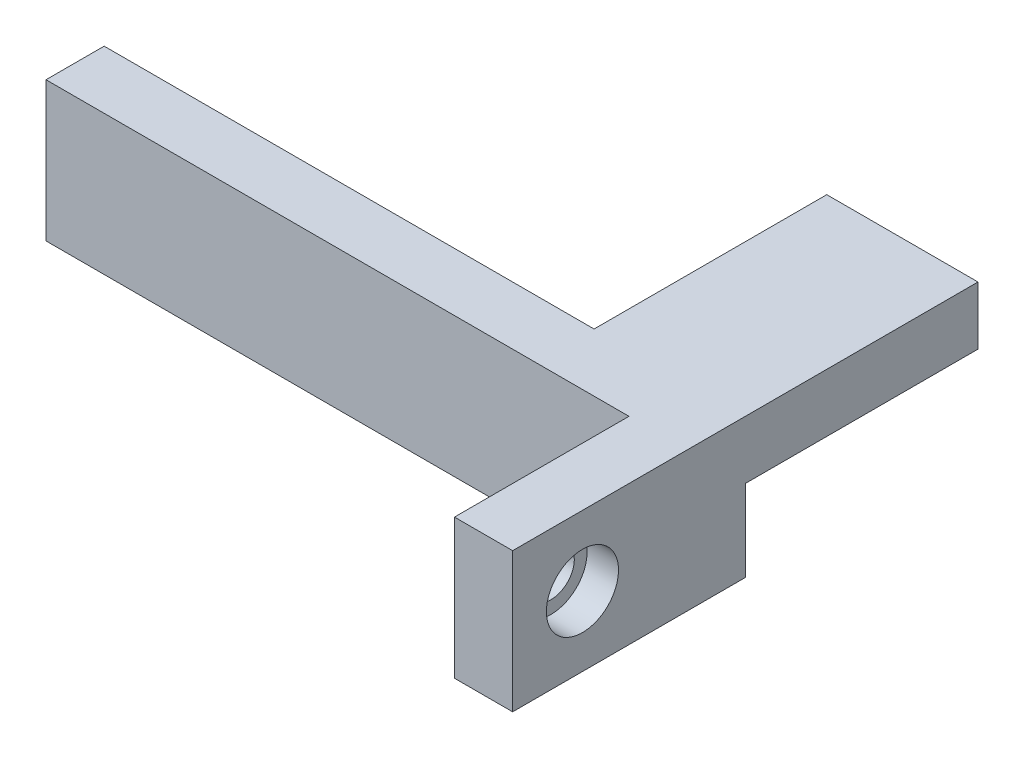
ISO-10303-21;
HEADER;
FILE_DESCRIPTION(('STEP AP214'),'2;1');
FILE_NAME('part.step','',(''),(''),'','','');
FILE_SCHEMA(('AUTOMOTIVE_DESIGN { 1 0 10303 214 1 1 1 1 }'));
ENDSEC;
DATA;
#1=APPLICATION_CONTEXT('core data for automotive mechanical design processes');
#2=APPLICATION_PROTOCOL_DEFINITION('international standard','automotive_design',2000,#1);
#3=PRODUCT_CONTEXT('',#1,'mechanical');
#4=PRODUCT('Part','Part','',(#3));
#5=PRODUCT_RELATED_PRODUCT_CATEGORY('part','',(#4));
#6=PRODUCT_DEFINITION_FORMATION('','',#4);
#7=PRODUCT_DEFINITION_CONTEXT('part definition',#1,'design');
#8=PRODUCT_DEFINITION('design','',#6,#7);
#9=PRODUCT_DEFINITION_SHAPE('','',#8);
#10=(LENGTH_UNIT() NAMED_UNIT(*) SI_UNIT(.MILLI.,.METRE.));
#11=(NAMED_UNIT(*) PLANE_ANGLE_UNIT() SI_UNIT($,.RADIAN.));
#12=(NAMED_UNIT(*) SI_UNIT($,.STERADIAN.) SOLID_ANGLE_UNIT());
#13=UNCERTAINTY_MEASURE_WITH_UNIT(LENGTH_MEASURE(1.E-05),#10,'distance_accuracy_value','');
#14=(GEOMETRIC_REPRESENTATION_CONTEXT(3) GLOBAL_UNCERTAINTY_ASSIGNED_CONTEXT((#13)) GLOBAL_UNIT_ASSIGNED_CONTEXT((#10,
#11,#12)) REPRESENTATION_CONTEXT('',''));
#15=CARTESIAN_POINT('',(0.,0.,0.));
#16=DIRECTION('',(0.,0.,1.));
#17=DIRECTION('',(1.,0.,0.));
#18=AXIS2_PLACEMENT_3D('',#15,#16,#17);
#19=CARTESIAN_POINT('',(-42.1106173211541,-0.999999999999982,9.));
#20=DIRECTION('',(1.,0.,0.));
#21=DIRECTION('',(0.,1.,0.));
#22=AXIS2_PLACEMENT_3D('',#19,#20,#21);
#23=CYLINDRICAL_SURFACE('',#22,2.);
#24=CARTESIAN_POINT('',(8.,-0.999999999999999,9.));
#25=DIRECTION('',(1.,0.,0.));
#26=DIRECTION('',(0.,0.,-1.));
#27=AXIS2_PLACEMENT_3D('',#24,#25,#26);
#28=CIRCLE('',#27,2.);
#29=CARTESIAN_POINT('',(7.99999999999999,1.,9.));
#30=VERTEX_POINT('',#29);
#31=EDGE_CURVE('E172',#30,#30,#28,.T.);
#32=CARTESIAN_POINT('',(10.3,-1.,9.));
#33=DIRECTION('',(1.,0.,0.));
#34=DIRECTION('',(0.,1.,0.));
#35=AXIS2_PLACEMENT_3D('',#32,#33,#34);
#36=CIRCLE('',#35,2.);
#37=CARTESIAN_POINT('',(10.3,1.,9.));
#38=VERTEX_POINT('',#37);
#39=EDGE_CURVE('E65',#38,#38,#36,.F.);
#40=CARTESIAN_POINT('',(7.99999999999999,1.,9.));
#41=CARTESIAN_POINT('',(8.02395833333333,1.,9.));
#42=CARTESIAN_POINT('',(8.04791666666666,1.,9.));
#43=CARTESIAN_POINT('',(8.09583333333332,1.,9.));
#44=CARTESIAN_POINT('',(8.11979166666666,1.,9.));
#45=CARTESIAN_POINT('',(8.16770833333333,1.,9.));
#46=CARTESIAN_POINT('',(8.19166666666666,1.,9.));
#47=CARTESIAN_POINT('',(8.23958333333333,1.,9.));
#48=CARTESIAN_POINT('',(8.26354166666666,1.,9.));
#49=CARTESIAN_POINT('',(8.31145833333333,1.,9.));
#50=CARTESIAN_POINT('',(8.33541666666666,1.,9.));
#51=CARTESIAN_POINT('',(8.38333333333333,1.,9.));
#52=CARTESIAN_POINT('',(8.40729166666666,1.,9.));
#53=CARTESIAN_POINT('',(8.45520833333333,1.,9.));
#54=CARTESIAN_POINT('',(8.47916666666666,1.,9.));
#55=CARTESIAN_POINT('',(8.52708333333333,1.,9.));
#56=CARTESIAN_POINT('',(8.55104166666666,1.,9.));
#57=CARTESIAN_POINT('',(8.59895833333333,1.,9.));
#58=CARTESIAN_POINT('',(8.62291666666667,1.,9.));
#59=CARTESIAN_POINT('',(8.67083333333333,1.,9.));
#60=CARTESIAN_POINT('',(8.69479166666667,1.,9.));
#61=CARTESIAN_POINT('',(8.74270833333333,1.,9.));
#62=CARTESIAN_POINT('',(8.76666666666666,1.,9.));
#63=CARTESIAN_POINT('',(8.81458333333333,1.,9.));
#64=CARTESIAN_POINT('',(8.83854166666666,1.,9.));
#65=CARTESIAN_POINT('',(8.88645833333333,1.,9.));
#66=CARTESIAN_POINT('',(8.91041666666666,1.,9.));
#67=CARTESIAN_POINT('',(8.95833333333333,1.,9.));
#68=CARTESIAN_POINT('',(8.98229166666667,1.,9.));
#69=CARTESIAN_POINT('',(9.03020833333333,1.,9.));
#70=CARTESIAN_POINT('',(9.05416666666667,1.,9.));
#71=CARTESIAN_POINT('',(9.10208333333333,1.,9.));
#72=CARTESIAN_POINT('',(9.12604166666667,1.,9.));
#73=CARTESIAN_POINT('',(9.17395833333333,1.,9.));
#74=CARTESIAN_POINT('',(9.19791666666666,1.,9.));
#75=CARTESIAN_POINT('',(9.24583333333333,1.,9.));
#76=CARTESIAN_POINT('',(9.26979166666666,1.,9.));
#77=CARTESIAN_POINT('',(9.31770833333333,1.,9.));
#78=CARTESIAN_POINT('',(9.34166666666667,1.,9.));
#79=CARTESIAN_POINT('',(9.38958333333333,1.,9.));
#80=CARTESIAN_POINT('',(9.41354166666667,1.,9.));
#81=CARTESIAN_POINT('',(9.46145833333333,1.,9.));
#82=CARTESIAN_POINT('',(9.48541666666667,1.,9.));
#83=CARTESIAN_POINT('',(9.53333333333333,1.,9.));
#84=CARTESIAN_POINT('',(9.55729166666667,1.,9.));
#85=CARTESIAN_POINT('',(9.60520833333333,1.,9.));
#86=CARTESIAN_POINT('',(9.62916666666667,1.,9.));
#87=CARTESIAN_POINT('',(9.67708333333333,1.,9.));
#88=CARTESIAN_POINT('',(9.70104166666667,1.,9.));
#89=CARTESIAN_POINT('',(9.74895833333333,1.,9.));
#90=CARTESIAN_POINT('',(9.77291666666667,1.,9.));
#91=CARTESIAN_POINT('',(9.82083333333334,1.,9.));
#92=CARTESIAN_POINT('',(9.84479166666667,1.,9.));
#93=CARTESIAN_POINT('',(9.89270833333333,1.,9.));
#94=CARTESIAN_POINT('',(9.91666666666667,1.,9.));
#95=CARTESIAN_POINT('',(9.96458333333333,1.,9.));
#96=CARTESIAN_POINT('',(9.98854166666667,1.,9.));
#97=CARTESIAN_POINT('',(10.0364583333333,1.,9.));
#98=CARTESIAN_POINT('',(10.0604166666667,1.,9.));
#99=CARTESIAN_POINT('',(10.1083333333333,1.,9.));
#100=CARTESIAN_POINT('',(10.1322916666667,1.,9.));
#101=CARTESIAN_POINT('',(10.1802083333333,1.,9.));
#102=CARTESIAN_POINT('',(10.2041666666667,1.,9.));
#103=CARTESIAN_POINT('',(10.2520833333333,1.,9.));
#104=CARTESIAN_POINT('',(10.2760416666667,1.,9.));
#105=CARTESIAN_POINT('',(10.3,1.,9.));
#106=B_SPLINE_CURVE_WITH_KNOTS('',3,(#40,#41,#42,#43,#44,#45,#46,#47,#48,#49,#50,#51,#52,#53,
#54,#55,#56,#57,#58,#59,#60,#61,#62,#63,#64,#65,#66,#67,#68,#69,#70,#71,#72,#73,#74,#75,#76,#77,
#78,#79,#80,#81,#82,#83,#84,#85,#86,#87,#88,#89,#90,#91,#92,#93,#94,#95,#96,#97,#98,#99,#100,
#101,#102,#103,#104,#105),.UNSPECIFIED.,.F.,.F.,(4,2,2,2,2,2,2,2,2,2,2,2,2,2,2,2,2,2,2,2,2,2,2,
2,2,2,2,2,2,2,2,2,4),(0.,0.071874999999999,0.143749999999998,0.215625000000004,
0.287500000000003,0.359375000000002,0.431250000000001,0.503125,0.575000000000006,
0.646875000000005,0.718750000000004,0.790625000000003,0.862500000000002,0.934375000000001,
1.00625000000001,1.07812500000001,1.15000000000001,1.221875,1.29375,1.36562500000001,
1.43750000000001,1.50937500000001,1.58125000000001,1.65312500000001,1.725,1.79687500000001,
1.86875000000001,1.94062500000001,2.01250000000001,2.08437500000001,2.15625000000001,
2.22812500000001,2.30000000000001),.UNSPECIFIED.);
#107=EDGE_CURVE('BSEAM61',#30,#38,#106,.T.);
#108=ORIENTED_EDGE('',*,*,#31,.F.);
#109=ORIENTED_EDGE('',*,*,#39,.F.);
#110=ORIENTED_EDGE('',*,*,#107,.T.);
#111=ORIENTED_EDGE('',*,*,#107,.F.);
#112=EDGE_LOOP('',(#108,#110,#109,#111));
#113=FACE_BOUND('',#112,.T.);
#114=ADVANCED_FACE('F61',(#113),#23,.F.);
#115=CARTESIAN_POINT('',(0.,0.,0.));
#116=DIRECTION('',(0.,1.,0.));
#117=DIRECTION('',(0.,0.,1.));
#118=AXIS2_PLACEMENT_3D('',#115,#116,#117);
#119=PLANE('',#118);
#120=DIRECTION('',(1.,0.,0.));
#121=VECTOR('',#120,1.);
#122=CARTESIAN_POINT('',(-42.1106173211541,0.,-5.));
#123=LINE('',#122,#121);
#124=CARTESIAN_POINT('',(0.,0.,-5.));
#125=VERTEX_POINT('',#124);
#126=CARTESIAN_POINT('',(13.,0.,-5.));
#127=VERTEX_POINT('',#126);
#128=EDGE_CURVE('E12',#125,#127,#123,.T.);
#129=ORIENTED_EDGE('',*,*,#128,.F.);
#130=DIRECTION('',(0.,0.,1.));
#131=VECTOR('',#130,1.);
#132=CARTESIAN_POINT('',(0.,0.,-25.));
#133=LINE('',#132,#131);
#134=CARTESIAN_POINT('',(0.,0.,-25.));
#135=VERTEX_POINT('',#134);
#136=EDGE_CURVE('E195',#135,#125,#133,.T.);
#137=ORIENTED_EDGE('',*,*,#136,.F.);
#138=DIRECTION('',(1.,0.,0.));
#139=VECTOR('',#138,1.);
#140=CARTESIAN_POINT('',(0.,0.,-25.));
#141=LINE('',#140,#139);
#142=CARTESIAN_POINT('',(13.,0.,-25.));
#143=VERTEX_POINT('',#142);
#144=EDGE_CURVE('E188',#135,#143,#141,.T.);
#145=ORIENTED_EDGE('',*,*,#144,.T.);
#146=DIRECTION('',(0.,0.,1.));
#147=VECTOR('',#146,1.);
#148=CARTESIAN_POINT('',(13.,0.,-25.));
#149=LINE('',#148,#147);
#150=EDGE_CURVE('E201',#143,#127,#149,.T.);
#151=ORIENTED_EDGE('',*,*,#150,.T.);
#152=EDGE_LOOP('',(#129,#137,#145,#151));
#153=FACE_BOUND('',#152,.T.);
#154=ADVANCED_FACE('F243',(#153),#119,.F.);
#155=CARTESIAN_POINT('',(-42.1106173211541,5.,0.));
#156=DIRECTION('',(-1.,0.,0.));
#157=DIRECTION('',(0.,0.,1.));
#158=AXIS2_PLACEMENT_3D('',#155,#156,#157);
#159=PLANE('',#158);
#160=DIRECTION('',(0.,-1.,0.));
#161=VECTOR('',#160,1.);
#162=CARTESIAN_POINT('',(-42.1106173211541,5.,-4.99999999999999));
#163=LINE('',#162,#161);
#164=CARTESIAN_POINT('',(-42.1106173211541,5.,-4.99999999999999));
#165=VERTEX_POINT('',#164);
#166=CARTESIAN_POINT('',(-42.1106173211541,-7.,-5.));
#167=VERTEX_POINT('',#166);
#168=EDGE_CURVE('E209',#165,#167,#163,.T.);
#169=ORIENTED_EDGE('',*,*,#168,.T.);
#170=DIRECTION('',(0.,0.,-1.));
#171=VECTOR('',#170,1.);
#172=CARTESIAN_POINT('',(-42.1106173211541,-7.,0.));
#173=LINE('',#172,#171);
#174=CARTESIAN_POINT('',(-42.1106173211541,-7.,0.));
#175=VERTEX_POINT('',#174);
#176=EDGE_CURVE('E151',#175,#167,#173,.T.);
#177=ORIENTED_EDGE('',*,*,#176,.F.);
#178=DIRECTION('',(0.,-1.,0.));
#179=VECTOR('',#178,1.);
#180=CARTESIAN_POINT('',(-42.1106173211541,5.,0.));
#181=LINE('',#180,#179);
#182=CARTESIAN_POINT('',(-42.1106173211541,5.,0.));
#183=VERTEX_POINT('',#182);
#184=EDGE_CURVE('E70',#183,#175,#181,.T.);
#185=ORIENTED_EDGE('',*,*,#184,.F.);
#186=DIRECTION('',(0.,0.,-1.));
#187=VECTOR('',#186,1.);
#188=CARTESIAN_POINT('',(-42.1106173211541,5.,0.));
#189=LINE('',#188,#187);
#190=EDGE_CURVE('E198',#183,#165,#189,.T.);
#191=ORIENTED_EDGE('',*,*,#190,.T.);
#192=EDGE_LOOP('',(#169,#177,#185,#191));
#193=FACE_BOUND('',#192,.T.);
#194=ADVANCED_FACE('F63',(#193),#159,.T.);
#195=CARTESIAN_POINT('',(0.,5.,0.));
#196=DIRECTION('',(0.,0.,1.));
#197=DIRECTION('',(1.,0.,0.));
#198=AXIS2_PLACEMENT_3D('',#195,#196,#197);
#199=PLANE('',#198);
#200=DIRECTION('',(0.,-1.,0.));
#201=VECTOR('',#200,1.);
#202=CARTESIAN_POINT('',(8.,0.,0.));
#203=LINE('',#202,#201);
#204=CARTESIAN_POINT('',(8.,5.,0.));
#205=VERTEX_POINT('',#204);
#206=CARTESIAN_POINT('',(7.99999999999999,-7.,0.));
#207=VERTEX_POINT('',#206);
#208=EDGE_CURVE('E78',#205,#207,#203,.T.);
#209=ORIENTED_EDGE('',*,*,#208,.F.);
#210=DIRECTION('',(-1.,0.,0.));
#211=VECTOR('',#210,1.);
#212=CARTESIAN_POINT('',(0.,5.,0.));
#213=LINE('',#212,#211);
#214=EDGE_CURVE('E206',#205,#183,#213,.T.);
#215=ORIENTED_EDGE('',*,*,#214,.T.);
#216=ORIENTED_EDGE('',*,*,#184,.T.);
#217=DIRECTION('',(1.,0.,0.));
#218=VECTOR('',#217,1.);
#219=CARTESIAN_POINT('',(-42.1106173211541,-7.,0.));
#220=LINE('',#219,#218);
#221=EDGE_CURVE('E163',#175,#207,#220,.T.);
#222=ORIENTED_EDGE('',*,*,#221,.T.);
#223=EDGE_LOOP('',(#209,#215,#216,#222));
#224=FACE_BOUND('',#223,.T.);
#225=ADVANCED_FACE('F267',(#224),#199,.T.);
#226=CARTESIAN_POINT('',(0.,5.,-5.));
#227=DIRECTION('',(0.,0.,1.));
#228=DIRECTION('',(1.,0.,0.));
#229=AXIS2_PLACEMENT_3D('',#226,#227,#228);
#230=PLANE('',#229);
#231=DIRECTION('',(0.,-1.,0.));
#232=VECTOR('',#231,1.);
#233=CARTESIAN_POINT('',(0.,5.,-5.));
#234=LINE('',#233,#232);
#235=CARTESIAN_POINT('',(0.,5.,-5.));
#236=VERTEX_POINT('',#235);
#237=EDGE_CURVE('E103',#236,#125,#234,.T.);
#238=ORIENTED_EDGE('',*,*,#237,.T.);
#239=ORIENTED_EDGE('',*,*,#128,.T.);
#240=DIRECTION('',(0.,1.,0.));
#241=VECTOR('',#240,1.);
#242=CARTESIAN_POINT('',(13.,-7.,-5.));
#243=LINE('',#242,#241);
#244=CARTESIAN_POINT('',(13.,-7.,-5.));
#245=VERTEX_POINT('',#244);
#246=EDGE_CURVE('E155',#245,#127,#243,.T.);
#247=ORIENTED_EDGE('',*,*,#246,.F.);
#248=DIRECTION('',(1.,0.,0.));
#249=VECTOR('',#248,1.);
#250=CARTESIAN_POINT('',(-42.1106173211541,-7.,-5.));
#251=LINE('',#250,#249);
#252=EDGE_CURVE('E142',#167,#245,#251,.T.);
#253=ORIENTED_EDGE('',*,*,#252,.F.);
#254=ORIENTED_EDGE('',*,*,#168,.F.);
#255=DIRECTION('',(-1.,0.,0.));
#256=VECTOR('',#255,1.);
#257=CARTESIAN_POINT('',(0.,5.,-5.));
#258=LINE('',#257,#256);
#259=EDGE_CURVE('E87',#236,#165,#258,.T.);
#260=ORIENTED_EDGE('',*,*,#259,.F.);
#261=EDGE_LOOP('',(#238,#239,#247,#253,#254,#260));
#262=FACE_BOUND('',#261,.T.);
#263=ADVANCED_FACE('F156',(#262),#230,.F.);
#264=CARTESIAN_POINT('',(0.,5.,0.));
#265=DIRECTION('',(0.,1.,0.));
#266=DIRECTION('',(0.,0.,1.));
#267=AXIS2_PLACEMENT_3D('',#264,#265,#266);
#268=PLANE('',#267);
#269=ORIENTED_EDGE('',*,*,#190,.F.);
#270=ORIENTED_EDGE('',*,*,#214,.F.);
#271=DIRECTION('',(0.,0.,-1.));
#272=VECTOR('',#271,1.);
#273=CARTESIAN_POINT('',(8.,5.,15.));
#274=LINE('',#273,#272);
#275=CARTESIAN_POINT('',(8.,5.,15.));
#276=VERTEX_POINT('',#275);
#277=EDGE_CURVE('E181',#276,#205,#274,.T.);
#278=ORIENTED_EDGE('',*,*,#277,.F.);
#279=DIRECTION('',(1.,0.,0.));
#280=VECTOR('',#279,1.);
#281=CARTESIAN_POINT('',(0.,5.,15.));
#282=LINE('',#281,#280);
#283=CARTESIAN_POINT('',(13.,5.,15.));
#284=VERTEX_POINT('',#283);
#285=EDGE_CURVE('E175',#276,#284,#282,.T.);
#286=ORIENTED_EDGE('',*,*,#285,.T.);
#287=DIRECTION('',(0.,0.,1.));
#288=VECTOR('',#287,1.);
#289=CARTESIAN_POINT('',(13.,5.,-25.));
#290=LINE('',#289,#288);
#291=CARTESIAN_POINT('',(13.,5.,-25.));
#292=VERTEX_POINT('',#291);
#293=EDGE_CURVE('E199',#292,#284,#290,.T.);
#294=ORIENTED_EDGE('',*,*,#293,.F.);
#295=DIRECTION('',(1.,0.,0.));
#296=VECTOR('',#295,1.);
#297=CARTESIAN_POINT('',(0.,5.,-25.));
#298=LINE('',#297,#296);
#299=CARTESIAN_POINT('',(0.,5.,-25.));
#300=VERTEX_POINT('',#299);
#301=EDGE_CURVE('E193',#300,#292,#298,.T.);
#302=ORIENTED_EDGE('',*,*,#301,.F.);
#303=DIRECTION('',(0.,0.,1.));
#304=VECTOR('',#303,1.);
#305=CARTESIAN_POINT('',(0.,5.,-25.));
#306=LINE('',#305,#304);
#307=EDGE_CURVE('E196',#300,#236,#306,.T.);
#308=ORIENTED_EDGE('',*,*,#307,.T.);
#309=ORIENTED_EDGE('',*,*,#259,.T.);
#310=EDGE_LOOP('',(#269,#270,#278,#286,#294,#302,#308,#309));
#311=FACE_BOUND('',#310,.T.);
#312=ADVANCED_FACE('F240',(#311),#268,.T.);
#313=CARTESIAN_POINT('',(0.,5.,-25.));
#314=DIRECTION('',(-1.,0.,0.));
#315=DIRECTION('',(0.,-1.,0.));
#316=AXIS2_PLACEMENT_3D('',#313,#314,#315);
#317=PLANE('',#316);
#318=ORIENTED_EDGE('',*,*,#237,.F.);
#319=ORIENTED_EDGE('',*,*,#307,.F.);
#320=DIRECTION('',(0.,-1.,0.));
#321=VECTOR('',#320,1.);
#322=CARTESIAN_POINT('',(0.,5.,-25.));
#323=LINE('',#322,#321);
#324=EDGE_CURVE('E185',#300,#135,#323,.T.);
#325=ORIENTED_EDGE('',*,*,#324,.T.);
#326=ORIENTED_EDGE('',*,*,#136,.T.);
#327=EDGE_LOOP('',(#318,#319,#325,#326));
#328=FACE_BOUND('',#327,.T.);
#329=ADVANCED_FACE('F231',(#328),#317,.T.);
#330=CARTESIAN_POINT('',(13.,5.,-25.));
#331=DIRECTION('',(-1.,0.,0.));
#332=DIRECTION('',(0.,0.,1.));
#333=AXIS2_PLACEMENT_3D('',#330,#331,#332);
#334=PLANE('',#333);
#335=CARTESIAN_POINT('',(13.,-1.,9.));
#336=DIRECTION('',(1.,0.,0.));
#337=DIRECTION('',(0.,1.,0.));
#338=AXIS2_PLACEMENT_3D('',#335,#336,#337);
#339=CIRCLE('',#338,3.1);
#340=CARTESIAN_POINT('',(13.,2.1,9.));
#341=VERTEX_POINT('',#340);
#342=EDGE_CURVE('E220',#341,#341,#339,.T.);
#343=ORIENTED_EDGE('',*,*,#342,.F.);
#344=EDGE_LOOP('',(#343));
#345=FACE_BOUND('',#344,.T.);
#346=ORIENTED_EDGE('',*,*,#293,.T.);
#347=DIRECTION('',(0.,-1.,0.));
#348=VECTOR('',#347,1.);
#349=CARTESIAN_POINT('',(13.,0.,15.));
#350=LINE('',#349,#348);
#351=CARTESIAN_POINT('',(13.,-7.,15.));
#352=VERTEX_POINT('',#351);
#353=EDGE_CURVE('E162',#284,#352,#350,.T.);
#354=ORIENTED_EDGE('',*,*,#353,.T.);
#355=DIRECTION('',(0.,0.,-1.));
#356=VECTOR('',#355,1.);
#357=CARTESIAN_POINT('',(13.,-7.,0.));
#358=LINE('',#357,#356);
#359=EDGE_CURVE('E148',#352,#245,#358,.T.);
#360=ORIENTED_EDGE('',*,*,#359,.T.);
#361=ORIENTED_EDGE('',*,*,#246,.T.);
#362=ORIENTED_EDGE('',*,*,#150,.F.);
#363=DIRECTION('',(0.,-1.,0.));
#364=VECTOR('',#363,1.);
#365=CARTESIAN_POINT('',(13.,5.,-25.));
#366=LINE('',#365,#364);
#367=EDGE_CURVE('E191',#292,#143,#366,.T.);
#368=ORIENTED_EDGE('',*,*,#367,.F.);
#369=EDGE_LOOP('',(#346,#354,#360,#361,#362,#368));
#370=FACE_BOUND('',#369,.T.);
#371=ADVANCED_FACE('F160',(#345,#370),#334,.F.);
#372=CARTESIAN_POINT('',(0.,0.,-25.));
#373=DIRECTION('',(0.,0.,1.));
#374=DIRECTION('',(1.,0.,0.));
#375=AXIS2_PLACEMENT_3D('',#372,#373,#374);
#376=PLANE('',#375);
#377=ORIENTED_EDGE('',*,*,#324,.F.);
#378=ORIENTED_EDGE('',*,*,#301,.T.);
#379=ORIENTED_EDGE('',*,*,#367,.T.);
#380=ORIENTED_EDGE('',*,*,#144,.F.);
#381=EDGE_LOOP('',(#377,#378,#379,#380));
#382=FACE_BOUND('',#381,.T.);
#383=ADVANCED_FACE('F230',(#382),#376,.F.);
#384=CARTESIAN_POINT('',(8.,0.,15.));
#385=DIRECTION('',(1.,0.,0.));
#386=DIRECTION('',(0.,0.,-1.));
#387=AXIS2_PLACEMENT_3D('',#384,#385,#386);
#388=PLANE('',#387);
#389=ORIENTED_EDGE('',*,*,#31,.T.);
#390=EDGE_LOOP('',(#389));
#391=FACE_BOUND('',#390,.T.);
#392=ORIENTED_EDGE('',*,*,#208,.T.);
#393=DIRECTION('',(0.,0.,1.));
#394=VECTOR('',#393,1.);
#395=CARTESIAN_POINT('',(8.,-7.,0.));
#396=LINE('',#395,#394);
#397=CARTESIAN_POINT('',(8.,-7.,15.));
#398=VERTEX_POINT('',#397);
#399=EDGE_CURVE('E165',#207,#398,#396,.T.);
#400=ORIENTED_EDGE('',*,*,#399,.T.);
#401=DIRECTION('',(0.,-1.,0.));
#402=VECTOR('',#401,1.);
#403=CARTESIAN_POINT('',(8.,0.,15.));
#404=LINE('',#403,#402);
#405=EDGE_CURVE('E178',#276,#398,#404,.T.);
#406=ORIENTED_EDGE('',*,*,#405,.F.);
#407=ORIENTED_EDGE('',*,*,#277,.T.);
#408=EDGE_LOOP('',(#392,#400,#406,#407));
#409=FACE_BOUND('',#408,.T.);
#410=ADVANCED_FACE('F237',(#391,#409),#388,.F.);
#411=CARTESIAN_POINT('',(0.,0.,15.));
#412=DIRECTION('',(0.,0.,1.));
#413=DIRECTION('',(1.,0.,0.));
#414=AXIS2_PLACEMENT_3D('',#411,#412,#413);
#415=PLANE('',#414);
#416=ORIENTED_EDGE('',*,*,#285,.F.);
#417=ORIENTED_EDGE('',*,*,#405,.T.);
#418=DIRECTION('',(-1.,0.,0.));
#419=VECTOR('',#418,1.);
#420=CARTESIAN_POINT('',(13.,-7.,15.));
#421=LINE('',#420,#419);
#422=EDGE_CURVE('E170',#352,#398,#421,.T.);
#423=ORIENTED_EDGE('',*,*,#422,.F.);
#424=ORIENTED_EDGE('',*,*,#353,.F.);
#425=EDGE_LOOP('',(#416,#417,#423,#424));
#426=FACE_BOUND('',#425,.T.);
#427=ADVANCED_FACE('F257',(#426),#415,.T.);
#428=CARTESIAN_POINT('',(0.,-7.,0.));
#429=DIRECTION('',(0.,1.,0.));
#430=DIRECTION('',(0.,0.,1.));
#431=AXIS2_PLACEMENT_3D('',#428,#429,#430);
#432=PLANE('',#431);
#433=ORIENTED_EDGE('',*,*,#221,.F.);
#434=ORIENTED_EDGE('',*,*,#176,.T.);
#435=ORIENTED_EDGE('',*,*,#252,.T.);
#436=ORIENTED_EDGE('',*,*,#359,.F.);
#437=ORIENTED_EDGE('',*,*,#422,.T.);
#438=ORIENTED_EDGE('',*,*,#399,.F.);
#439=EDGE_LOOP('',(#433,#434,#435,#436,#437,#438));
#440=FACE_BOUND('',#439,.T.);
#441=ADVANCED_FACE('F145',(#440),#432,.F.);
#442=CARTESIAN_POINT('',(10.3,-1.,9.));
#443=DIRECTION('',(1.,0.,0.));
#444=DIRECTION('',(0.,1.,0.));
#445=AXIS2_PLACEMENT_3D('',#442,#443,#444);
#446=PLANE('',#445);
#447=CARTESIAN_POINT('',(10.3,-1.,9.));
#448=DIRECTION('',(1.,0.,0.));
#449=DIRECTION('',(0.,1.,0.));
#450=AXIS2_PLACEMENT_3D('',#447,#448,#449);
#451=CIRCLE('',#450,3.1);
#452=CARTESIAN_POINT('',(10.3,2.1,9.));
#453=VERTEX_POINT('',#452);
#454=EDGE_CURVE('E216',#453,#453,#451,.T.);
#455=ORIENTED_EDGE('',*,*,#454,.T.);
#456=EDGE_LOOP('',(#455));
#457=FACE_BOUND('',#456,.T.);
#458=ORIENTED_EDGE('',*,*,#39,.T.);
#459=EDGE_LOOP('',(#458));
#460=FACE_BOUND('',#459,.T.);
#461=ADVANCED_FACE('F256',(#457,#460),#446,.T.);
#462=CARTESIAN_POINT('',(10.3,-1.,9.));
#463=DIRECTION('',(1.,0.,0.));
#464=DIRECTION('',(0.,1.,0.));
#465=AXIS2_PLACEMENT_3D('',#462,#463,#464);
#466=CYLINDRICAL_SURFACE('',#465,3.1);
#467=CARTESIAN_POINT('',(10.3,2.1,9.));
#468=CARTESIAN_POINT('',(10.328125,2.1,9.));
#469=CARTESIAN_POINT('',(10.35625,2.1,9.));
#470=CARTESIAN_POINT('',(10.4125,2.1,9.));
#471=CARTESIAN_POINT('',(10.440625,2.1,9.));
#472=CARTESIAN_POINT('',(10.496875,2.1,9.));
#473=CARTESIAN_POINT('',(10.525,2.1,9.));
#474=CARTESIAN_POINT('',(10.58125,2.1,9.));
#475=CARTESIAN_POINT('',(10.609375,2.1,9.));
#476=CARTESIAN_POINT('',(10.665625,2.1,9.));
#477=CARTESIAN_POINT('',(10.69375,2.1,9.));
#478=CARTESIAN_POINT('',(10.75,2.1,9.));
#479=CARTESIAN_POINT('',(10.778125,2.1,9.));
#480=CARTESIAN_POINT('',(10.834375,2.1,9.));
#481=CARTESIAN_POINT('',(10.8625,2.1,9.));
#482=CARTESIAN_POINT('',(10.91875,2.1,9.));
#483=CARTESIAN_POINT('',(10.946875,2.1,9.));
#484=CARTESIAN_POINT('',(11.003125,2.1,9.));
#485=CARTESIAN_POINT('',(11.03125,2.1,9.));
#486=CARTESIAN_POINT('',(11.0875,2.1,9.));
#487=CARTESIAN_POINT('',(11.115625,2.1,9.));
#488=CARTESIAN_POINT('',(11.171875,2.1,9.));
#489=CARTESIAN_POINT('',(11.2,2.1,9.));
#490=CARTESIAN_POINT('',(11.25625,2.1,9.));
#491=CARTESIAN_POINT('',(11.284375,2.1,9.));
#492=CARTESIAN_POINT('',(11.340625,2.1,9.));
#493=CARTESIAN_POINT('',(11.36875,2.1,9.));
#494=CARTESIAN_POINT('',(11.425,2.1,9.));
#495=CARTESIAN_POINT('',(11.453125,2.1,9.));
#496=CARTESIAN_POINT('',(11.509375,2.1,9.));
#497=CARTESIAN_POINT('',(11.5375,2.1,9.));
#498=CARTESIAN_POINT('',(11.59375,2.1,9.));
#499=CARTESIAN_POINT('',(11.621875,2.1,9.));
#500=CARTESIAN_POINT('',(11.678125,2.1,9.));
#501=CARTESIAN_POINT('',(11.70625,2.1,9.));
#502=CARTESIAN_POINT('',(11.7625,2.1,9.));
#503=CARTESIAN_POINT('',(11.790625,2.1,9.));
#504=CARTESIAN_POINT('',(11.846875,2.1,9.));
#505=CARTESIAN_POINT('',(11.875,2.1,9.));
#506=CARTESIAN_POINT('',(11.93125,2.1,9.));
#507=CARTESIAN_POINT('',(11.959375,2.1,9.));
#508=CARTESIAN_POINT('',(12.015625,2.1,9.));
#509=CARTESIAN_POINT('',(12.04375,2.1,9.));
#510=CARTESIAN_POINT('',(12.1,2.1,9.));
#511=CARTESIAN_POINT('',(12.128125,2.1,9.));
#512=CARTESIAN_POINT('',(12.184375,2.1,9.));
#513=CARTESIAN_POINT('',(12.2125,2.1,9.));
#514=CARTESIAN_POINT('',(12.26875,2.1,9.));
#515=CARTESIAN_POINT('',(12.296875,2.1,9.));
#516=CARTESIAN_POINT('',(12.353125,2.1,9.));
#517=CARTESIAN_POINT('',(12.38125,2.1,9.));
#518=CARTESIAN_POINT('',(12.4375,2.1,9.));
#519=CARTESIAN_POINT('',(12.465625,2.1,9.));
#520=CARTESIAN_POINT('',(12.521875,2.1,9.));
#521=CARTESIAN_POINT('',(12.55,2.1,9.));
#522=CARTESIAN_POINT('',(12.60625,2.1,9.));
#523=CARTESIAN_POINT('',(12.634375,2.1,9.));
#524=CARTESIAN_POINT('',(12.690625,2.1,9.));
#525=CARTESIAN_POINT('',(12.71875,2.1,9.));
#526=CARTESIAN_POINT('',(12.775,2.1,9.));
#527=CARTESIAN_POINT('',(12.803125,2.1,9.));
#528=CARTESIAN_POINT('',(12.859375,2.1,9.));
#529=CARTESIAN_POINT('',(12.8875,2.1,9.));
#530=CARTESIAN_POINT('',(12.94375,2.1,9.));
#531=CARTESIAN_POINT('',(12.971875,2.1,9.));
#532=CARTESIAN_POINT('',(13.,2.1,9.));
#533=B_SPLINE_CURVE_WITH_KNOTS('',3,(#467,#468,#469,#470,#471,#472,#473,#474,#475,#476,#477,
#478,#479,#480,#481,#482,#483,#484,#485,#486,#487,#488,#489,#490,#491,#492,#493,#494,#495,#496,
#497,#498,#499,#500,#501,#502,#503,#504,#505,#506,#507,#508,#509,#510,#511,#512,#513,#514,#515,
#516,#517,#518,#519,#520,#521,#522,#523,#524,#525,#526,#527,#528,#529,#530,#531,#532),
.UNSPECIFIED.,.F.,.F.,(4,2,2,2,2,2,2,2,2,2,2,2,2,2,2,2,2,2,2,2,2,2,2,2,2,2,2,2,2,2,2,2,4),(0.,
0.0843750000000011,0.168750000000001,0.253125,0.337500000000001,0.421875,0.50625,
0.590625000000001,0.675,0.759375000000001,0.843750000000001,0.928125,1.0125,1.096875,1.18125,
1.265625,1.35,1.434375,1.51875,1.603125,1.6875,1.771875,1.85625,1.940625,2.025,2.109375,2.19375,
2.278125,2.3625,2.446875,2.53125,2.615625,2.7),.UNSPECIFIED.);
#534=EDGE_CURVE('BSEAM227',#453,#341,#533,.T.);
#535=ORIENTED_EDGE('',*,*,#454,.F.);
#536=ORIENTED_EDGE('',*,*,#342,.T.);
#537=ORIENTED_EDGE('',*,*,#534,.T.);
#538=ORIENTED_EDGE('',*,*,#534,.F.);
#539=EDGE_LOOP('',(#535,#537,#536,#538));
#540=FACE_BOUND('',#539,.T.);
#541=ADVANCED_FACE('F227',(#540),#466,.F.);
#542=CLOSED_SHELL('',(#114,#154,#194,#225,#263,#312,#329,#371,#383,#410,#427,#441,#461,#541));
#543=MANIFOLD_SOLID_BREP('B2',#542);
#544=ADVANCED_BREP_SHAPE_REPRESENTATION('',(#18,#543),#14);
#545=SHAPE_DEFINITION_REPRESENTATION(#9,#544);
ENDSEC;
END-ISO-10303-21;
